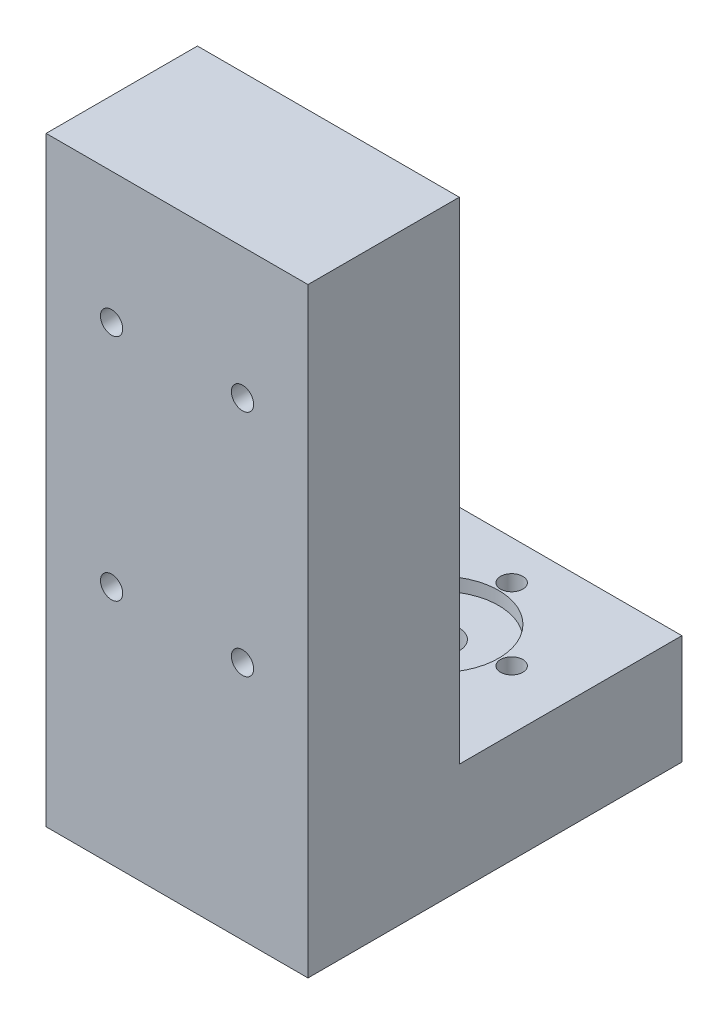
ISO-10303-21;
HEADER;
FILE_DESCRIPTION(('STEP AP214'),'2;1');
FILE_NAME('part.step','',(''),(''),'','','');
FILE_SCHEMA(('AUTOMOTIVE_DESIGN { 1 0 10303 214 1 1 1 1 }'));
ENDSEC;
DATA;
#1=APPLICATION_CONTEXT('core data for automotive mechanical design processes');
#2=APPLICATION_PROTOCOL_DEFINITION('international standard','automotive_design',2000,#1);
#3=PRODUCT_CONTEXT('',#1,'mechanical');
#4=PRODUCT('Part','Part','',(#3));
#5=PRODUCT_RELATED_PRODUCT_CATEGORY('part','',(#4));
#6=PRODUCT_DEFINITION_FORMATION('','',#4);
#7=PRODUCT_DEFINITION_CONTEXT('part definition',#1,'design');
#8=PRODUCT_DEFINITION('design','',#6,#7);
#9=PRODUCT_DEFINITION_SHAPE('','',#8);
#10=(LENGTH_UNIT() NAMED_UNIT(*) SI_UNIT(.MILLI.,.METRE.));
#11=(NAMED_UNIT(*) PLANE_ANGLE_UNIT() SI_UNIT($,.RADIAN.));
#12=(NAMED_UNIT(*) SI_UNIT($,.STERADIAN.) SOLID_ANGLE_UNIT());
#13=UNCERTAINTY_MEASURE_WITH_UNIT(LENGTH_MEASURE(1.E-05),#10,'distance_accuracy_value','');
#14=(GEOMETRIC_REPRESENTATION_CONTEXT(3) GLOBAL_UNCERTAINTY_ASSIGNED_CONTEXT((#13)) GLOBAL_UNIT_ASSIGNED_CONTEXT((#10,
#11,#12)) REPRESENTATION_CONTEXT('',''));
#15=CARTESIAN_POINT('',(0.,0.,0.));
#16=DIRECTION('',(0.,0.,1.));
#17=DIRECTION('',(1.,0.,0.));
#18=AXIS2_PLACEMENT_3D('',#15,#16,#17);
#19=CARTESIAN_POINT('',(10.,20.,27.9206936952474));
#20=DIRECTION('',(0.,0.,-1.));
#21=DIRECTION('',(0.,1.,0.));
#22=AXIS2_PLACEMENT_3D('',#19,#20,#21);
#23=CYLINDRICAL_SURFACE('',#22,1.7);
#24=CARTESIAN_POINT('',(10.,20.,23.1123675831789));
#25=DIRECTION('',(0.,0.,-1.));
#26=DIRECTION('',(-1.,0.,0.));
#27=AXIS2_PLACEMENT_3D('',#24,#25,#26);
#28=CIRCLE('',#27,1.7);
#29=CARTESIAN_POINT('',(10.,21.7,23.1123675831789));
#30=VERTEX_POINT('',#29);
#31=EDGE_CURVE('E53',#30,#30,#28,.F.);
#32=CARTESIAN_POINT('',(10.,20.,0.));
#33=DIRECTION('',(0.,0.,-1.));
#34=DIRECTION('',(0.,1.,0.));
#35=AXIS2_PLACEMENT_3D('',#32,#33,#34);
#36=CIRCLE('',#35,1.7);
#37=CARTESIAN_POINT('',(10.,21.7,0.));
#38=VERTEX_POINT('',#37);
#39=EDGE_CURVE('E11',#38,#38,#36,.T.);
#40=CARTESIAN_POINT('',(10.,21.7,23.1123675831789));
#41=CARTESIAN_POINT('',(10.,21.7,22.8716137541875));
#42=CARTESIAN_POINT('',(10.,21.7,22.630859925196));
#43=CARTESIAN_POINT('',(10.,21.7,22.1493522672131));
#44=CARTESIAN_POINT('',(10.,21.7,21.9085984382217));
#45=CARTESIAN_POINT('',(10.,21.7,21.4270907802388));
#46=CARTESIAN_POINT('',(10.,21.7,21.1863369512473));
#47=CARTESIAN_POINT('',(10.,21.7,20.7048292932644));
#48=CARTESIAN_POINT('',(10.,21.7,20.464075464273));
#49=CARTESIAN_POINT('',(10.,21.7,19.9825678062901));
#50=CARTESIAN_POINT('',(10.,21.7,19.7418139772987));
#51=CARTESIAN_POINT('',(10.,21.7,19.2603063193158));
#52=CARTESIAN_POINT('',(10.,21.7,19.0195524903243));
#53=CARTESIAN_POINT('',(10.,21.7,18.5380448323414));
#54=CARTESIAN_POINT('',(10.,21.7,18.29729100335));
#55=CARTESIAN_POINT('',(10.,21.7,17.8157833453671));
#56=CARTESIAN_POINT('',(10.,21.7,17.5750295163756));
#57=CARTESIAN_POINT('',(10.,21.7,17.0935218583927));
#58=CARTESIAN_POINT('',(10.,21.7,16.8527680294013));
#59=CARTESIAN_POINT('',(10.,21.7,16.3712603714184));
#60=CARTESIAN_POINT('',(10.,21.7,16.130506542427));
#61=CARTESIAN_POINT('',(10.,21.7,15.6489988844441));
#62=CARTESIAN_POINT('',(10.,21.7,15.4082450554526));
#63=CARTESIAN_POINT('',(10.,21.7,14.9267373974697));
#64=CARTESIAN_POINT('',(10.,21.7,14.6859835684783));
#65=CARTESIAN_POINT('',(10.,21.7,14.2044759104954));
#66=CARTESIAN_POINT('',(10.,21.7,13.9637220815039));
#67=CARTESIAN_POINT('',(10.,21.7,13.482214423521));
#68=CARTESIAN_POINT('',(10.,21.7,13.2414605945296));
#69=CARTESIAN_POINT('',(10.,21.7,12.7599529365467));
#70=CARTESIAN_POINT('',(10.,21.7,12.5191991075553));
#71=CARTESIAN_POINT('',(10.,21.7,12.0376914495724));
#72=CARTESIAN_POINT('',(10.,21.7,11.7969376205809));
#73=CARTESIAN_POINT('',(10.,21.7,11.315429962598));
#74=CARTESIAN_POINT('',(10.,21.7,11.0746761336066));
#75=CARTESIAN_POINT('',(10.,21.7,10.5931684756237));
#76=CARTESIAN_POINT('',(10.,21.7,10.3524146466322));
#77=CARTESIAN_POINT('',(10.,21.7,9.87090698864933));
#78=CARTESIAN_POINT('',(10.,21.7,9.63015315965789));
#79=CARTESIAN_POINT('',(10.,21.7,9.14864550167499));
#80=CARTESIAN_POINT('',(10.,21.7,8.90789167268355));
#81=CARTESIAN_POINT('',(10.,21.7,8.42638401470065));
#82=CARTESIAN_POINT('',(10.,21.7,8.18563018570921));
#83=CARTESIAN_POINT('',(10.,21.7,7.70412252772631));
#84=CARTESIAN_POINT('',(10.,21.7,7.46336869873486));
#85=CARTESIAN_POINT('',(10.,21.7,6.98186104075197));
#86=CARTESIAN_POINT('',(10.,21.7,6.74110721176052));
#87=CARTESIAN_POINT('',(10.,21.7,6.25959955377763));
#88=CARTESIAN_POINT('',(10.,21.7,6.01884572478618));
#89=CARTESIAN_POINT('',(10.,21.7,5.53733806680329));
#90=CARTESIAN_POINT('',(10.,21.7,5.29658423781184));
#91=CARTESIAN_POINT('',(10.,21.7,4.81507657982895));
#92=CARTESIAN_POINT('',(10.,21.7,4.5743227508375));
#93=CARTESIAN_POINT('',(10.,21.7,4.0928150928546));
#94=CARTESIAN_POINT('',(10.,21.7,3.85206126386316));
#95=CARTESIAN_POINT('',(10.,21.7,3.37055360588026));
#96=CARTESIAN_POINT('',(10.,21.7,3.12979977688882));
#97=CARTESIAN_POINT('',(10.,21.7,2.64829211890592));
#98=CARTESIAN_POINT('',(10.,21.7,2.40753828991448));
#99=CARTESIAN_POINT('',(10.,21.7,1.92603063193158));
#100=CARTESIAN_POINT('',(10.,21.7,1.68527680294013));
#101=CARTESIAN_POINT('',(10.,21.7,1.20376914495724));
#102=CARTESIAN_POINT('',(10.,21.7,0.963015315965794));
#103=CARTESIAN_POINT('',(10.,21.7,0.4815076579829));
#104=CARTESIAN_POINT('',(10.,21.7,0.240753828991452));
#105=CARTESIAN_POINT('',(10.,21.7,0.));
#106=B_SPLINE_CURVE_WITH_KNOTS('',3,(#40,#41,#42,#43,#44,#45,#46,#47,#48,#49,#50,#51,#52,#53,
#54,#55,#56,#57,#58,#59,#60,#61,#62,#63,#64,#65,#66,#67,#68,#69,#70,#71,#72,#73,#74,#75,#76,#77,
#78,#79,#80,#81,#82,#83,#84,#85,#86,#87,#88,#89,#90,#91,#92,#93,#94,#95,#96,#97,#98,#99,#100,
#101,#102,#103,#104,#105),.UNSPECIFIED.,.F.,.F.,(4,2,2,2,2,2,2,2,2,2,2,2,2,2,2,2,2,2,2,2,2,2,2,
2,2,2,2,2,2,2,2,2,4),(0.,0.722261486974341,1.44452297394868,2.16678446092302,2.88904594789736,
3.61130743487171,4.33356892184605,5.05583040882039,5.77809189579473,6.50035338276907,
7.22261486974341,7.94487635671775,8.66713784369209,9.38939933066644,10.1116608176408,
10.8339223046151,11.5561837915895,12.2784452785638,13.0007067655381,13.7229682525125,
14.4452297394868,15.1674912264612,15.8897527134355,16.6120142004098,17.3342756873842,
18.0565371743585,18.7787986613329,19.5010601483072,20.2233216352816,20.9455831222559,
21.6678446092302,22.3901060962046,23.1123675831789),.UNSPECIFIED.);
#107=EDGE_CURVE('BSEAM44',#30,#38,#106,.T.);
#108=ORIENTED_EDGE('',*,*,#31,.T.);
#109=ORIENTED_EDGE('',*,*,#39,.T.);
#110=ORIENTED_EDGE('',*,*,#107,.T.);
#111=ORIENTED_EDGE('',*,*,#107,.F.);
#112=EDGE_LOOP('',(#108,#110,#109,#111));
#113=FACE_BOUND('',#112,.T.);
#114=ADVANCED_FACE('F44',(#113),#23,.F.);
#115=CARTESIAN_POINT('',(-10.,20.,27.9206936952474));
#116=DIRECTION('',(0.,0.,-1.));
#117=DIRECTION('',(0.,1.,0.));
#118=AXIS2_PLACEMENT_3D('',#115,#116,#117);
#119=CYLINDRICAL_SURFACE('',#118,1.7);
#120=CARTESIAN_POINT('',(-10.,20.,23.1123675831789));
#121=DIRECTION('',(0.,0.,-1.));
#122=DIRECTION('',(-1.,0.,0.));
#123=AXIS2_PLACEMENT_3D('',#120,#121,#122);
#124=CIRCLE('',#123,1.7);
#125=CARTESIAN_POINT('',(-10.,21.7,23.1123675831789));
#126=VERTEX_POINT('',#125);
#127=EDGE_CURVE('E168',#126,#126,#124,.F.);
#128=CARTESIAN_POINT('',(-10.,20.,0.));
#129=DIRECTION('',(0.,0.,-1.));
#130=DIRECTION('',(0.,1.,0.));
#131=AXIS2_PLACEMENT_3D('',#128,#129,#130);
#132=CIRCLE('',#131,1.7);
#133=CARTESIAN_POINT('',(-10.,21.7,0.));
#134=VERTEX_POINT('',#133);
#135=EDGE_CURVE('E174',#134,#134,#132,.T.);
#136=CARTESIAN_POINT('',(-10.,21.7,23.1123675831789));
#137=CARTESIAN_POINT('',(-10.,21.7,22.8716137541875));
#138=CARTESIAN_POINT('',(-10.,21.7,22.630859925196));
#139=CARTESIAN_POINT('',(-10.,21.7,22.1493522672131));
#140=CARTESIAN_POINT('',(-10.,21.7,21.9085984382217));
#141=CARTESIAN_POINT('',(-10.,21.7,21.4270907802388));
#142=CARTESIAN_POINT('',(-10.,21.7,21.1863369512473));
#143=CARTESIAN_POINT('',(-10.,21.7,20.7048292932644));
#144=CARTESIAN_POINT('',(-10.,21.7,20.464075464273));
#145=CARTESIAN_POINT('',(-10.,21.7,19.9825678062901));
#146=CARTESIAN_POINT('',(-10.,21.7,19.7418139772987));
#147=CARTESIAN_POINT('',(-10.,21.7,19.2603063193158));
#148=CARTESIAN_POINT('',(-10.,21.7,19.0195524903243));
#149=CARTESIAN_POINT('',(-10.,21.7,18.5380448323414));
#150=CARTESIAN_POINT('',(-10.,21.7,18.29729100335));
#151=CARTESIAN_POINT('',(-10.,21.7,17.8157833453671));
#152=CARTESIAN_POINT('',(-10.,21.7,17.5750295163756));
#153=CARTESIAN_POINT('',(-10.,21.7,17.0935218583927));
#154=CARTESIAN_POINT('',(-10.,21.7,16.8527680294013));
#155=CARTESIAN_POINT('',(-10.,21.7,16.3712603714184));
#156=CARTESIAN_POINT('',(-10.,21.7,16.130506542427));
#157=CARTESIAN_POINT('',(-10.,21.7,15.6489988844441));
#158=CARTESIAN_POINT('',(-10.,21.7,15.4082450554526));
#159=CARTESIAN_POINT('',(-10.,21.7,14.9267373974697));
#160=CARTESIAN_POINT('',(-10.,21.7,14.6859835684783));
#161=CARTESIAN_POINT('',(-10.,21.7,14.2044759104954));
#162=CARTESIAN_POINT('',(-10.,21.7,13.9637220815039));
#163=CARTESIAN_POINT('',(-10.,21.7,13.482214423521));
#164=CARTESIAN_POINT('',(-10.,21.7,13.2414605945296));
#165=CARTESIAN_POINT('',(-10.,21.7,12.7599529365467));
#166=CARTESIAN_POINT('',(-10.,21.7,12.5191991075553));
#167=CARTESIAN_POINT('',(-10.,21.7,12.0376914495724));
#168=CARTESIAN_POINT('',(-10.,21.7,11.7969376205809));
#169=CARTESIAN_POINT('',(-10.,21.7,11.315429962598));
#170=CARTESIAN_POINT('',(-10.,21.7,11.0746761336066));
#171=CARTESIAN_POINT('',(-10.,21.7,10.5931684756237));
#172=CARTESIAN_POINT('',(-10.,21.7,10.3524146466322));
#173=CARTESIAN_POINT('',(-10.,21.7,9.87090698864933));
#174=CARTESIAN_POINT('',(-10.,21.7,9.63015315965789));
#175=CARTESIAN_POINT('',(-10.,21.7,9.14864550167499));
#176=CARTESIAN_POINT('',(-10.,21.7,8.90789167268355));
#177=CARTESIAN_POINT('',(-10.,21.7,8.42638401470065));
#178=CARTESIAN_POINT('',(-10.,21.7,8.18563018570921));
#179=CARTESIAN_POINT('',(-10.,21.7,7.70412252772631));
#180=CARTESIAN_POINT('',(-10.,21.7,7.46336869873486));
#181=CARTESIAN_POINT('',(-10.,21.7,6.98186104075197));
#182=CARTESIAN_POINT('',(-10.,21.7,6.74110721176052));
#183=CARTESIAN_POINT('',(-10.,21.7,6.25959955377763));
#184=CARTESIAN_POINT('',(-10.,21.7,6.01884572478618));
#185=CARTESIAN_POINT('',(-10.,21.7,5.53733806680329));
#186=CARTESIAN_POINT('',(-10.,21.7,5.29658423781184));
#187=CARTESIAN_POINT('',(-10.,21.7,4.81507657982895));
#188=CARTESIAN_POINT('',(-10.,21.7,4.5743227508375));
#189=CARTESIAN_POINT('',(-10.,21.7,4.0928150928546));
#190=CARTESIAN_POINT('',(-10.,21.7,3.85206126386316));
#191=CARTESIAN_POINT('',(-10.,21.7,3.37055360588026));
#192=CARTESIAN_POINT('',(-10.,21.7,3.12979977688882));
#193=CARTESIAN_POINT('',(-10.,21.7,2.64829211890592));
#194=CARTESIAN_POINT('',(-10.,21.7,2.40753828991448));
#195=CARTESIAN_POINT('',(-10.,21.7,1.92603063193158));
#196=CARTESIAN_POINT('',(-10.,21.7,1.68527680294013));
#197=CARTESIAN_POINT('',(-10.,21.7,1.20376914495724));
#198=CARTESIAN_POINT('',(-10.,21.7,0.963015315965794));
#199=CARTESIAN_POINT('',(-10.,21.7,0.4815076579829));
#200=CARTESIAN_POINT('',(-10.,21.7,0.240753828991452));
#201=CARTESIAN_POINT('',(-10.,21.7,0.));
#202=B_SPLINE_CURVE_WITH_KNOTS('',3,(#136,#137,#138,#139,#140,#141,#142,#143,#144,#145,#146,
#147,#148,#149,#150,#151,#152,#153,#154,#155,#156,#157,#158,#159,#160,#161,#162,#163,#164,#165,
#166,#167,#168,#169,#170,#171,#172,#173,#174,#175,#176,#177,#178,#179,#180,#181,#182,#183,#184,
#185,#186,#187,#188,#189,#190,#191,#192,#193,#194,#195,#196,#197,#198,#199,#200,#201),
.UNSPECIFIED.,.F.,.F.,(4,2,2,2,2,2,2,2,2,2,2,2,2,2,2,2,2,2,2,2,2,2,2,2,2,2,2,2,2,2,2,2,4),(0.,
0.722261486974341,1.44452297394868,2.16678446092302,2.88904594789736,3.61130743487171,
4.33356892184605,5.05583040882039,5.77809189579473,6.50035338276907,7.22261486974341,
7.94487635671775,8.66713784369209,9.38939933066644,10.1116608176408,10.8339223046151,
11.5561837915895,12.2784452785638,13.0007067655381,13.7229682525125,14.4452297394868,
15.1674912264612,15.8897527134355,16.6120142004098,17.3342756873842,18.0565371743585,
18.7787986613329,19.5010601483072,20.2233216352816,20.9455831222559,21.6678446092302,
22.3901060962046,23.1123675831789),.UNSPECIFIED.);
#203=EDGE_CURVE('BSEAM204',#126,#134,#202,.T.);
#204=ORIENTED_EDGE('',*,*,#127,.T.);
#205=ORIENTED_EDGE('',*,*,#135,.T.);
#206=ORIENTED_EDGE('',*,*,#203,.T.);
#207=ORIENTED_EDGE('',*,*,#203,.F.);
#208=EDGE_LOOP('',(#204,#206,#205,#207));
#209=FACE_BOUND('',#208,.T.);
#210=ADVANCED_FACE('F204',(#209),#119,.F.);
#211=CARTESIAN_POINT('',(0.,-25.2143187875923,-17.));
#212=DIRECTION('',(0.,1.,0.));
#213=DIRECTION('',(0.,0.,1.));
#214=AXIS2_PLACEMENT_3D('',#211,#212,#213);
#215=CYLINDRICAL_SURFACE('',#214,3.);
#216=CARTESIAN_POINT('',(0.,-16.7290374133537,-17.));
#217=DIRECTION('',(0.,1.,0.));
#218=DIRECTION('',(0.,0.,1.));
#219=AXIS2_PLACEMENT_3D('',#216,#217,#218);
#220=CIRCLE('',#219,3.);
#221=CARTESIAN_POINT('',(0.,-16.7290374133537,-14.));
#222=VERTEX_POINT('',#221);
#223=EDGE_CURVE('E138',#222,#222,#220,.F.);
#224=ORIENTED_EDGE('',*,*,#223,.T.);
#225=EDGE_LOOP('',(#224));
#226=FACE_BOUND('',#225,.T.);
#227=CARTESIAN_POINT('',(0.,-2.,-17.));
#228=DIRECTION('',(0.,1.,0.));
#229=DIRECTION('',(0.,0.,1.));
#230=AXIS2_PLACEMENT_3D('',#227,#228,#229);
#231=CIRCLE('',#230,3.);
#232=CARTESIAN_POINT('',(0.,-2.,-14.));
#233=VERTEX_POINT('',#232);
#234=EDGE_CURVE('E170',#233,#233,#231,.F.);
#235=ORIENTED_EDGE('',*,*,#234,.F.);
#236=EDGE_LOOP('',(#235));
#237=FACE_BOUND('',#236,.T.);
#238=ADVANCED_FACE('F210',(#226,#237),#215,.F.);
#239=CARTESIAN_POINT('',(20.,75.,0.));
#240=DIRECTION('',(0.,0.,1.));
#241=DIRECTION('',(0.,-1.,0.));
#242=AXIS2_PLACEMENT_3D('',#239,#240,#241);
#243=PLANE('',#242);
#244=CARTESIAN_POINT('',(10.,55.,0.));
#245=DIRECTION('',(0.,0.,-1.));
#246=DIRECTION('',(0.,1.,0.));
#247=AXIS2_PLACEMENT_3D('',#244,#245,#246);
#248=CIRCLE('',#247,1.7);
#249=CARTESIAN_POINT('',(10.,56.7,0.));
#250=VERTEX_POINT('',#249);
#251=EDGE_CURVE('E224',#250,#250,#248,.T.);
#252=ORIENTED_EDGE('',*,*,#251,.F.);
#253=EDGE_LOOP('',(#252));
#254=FACE_BOUND('',#253,.T.);
#255=CARTESIAN_POINT('',(-10.,55.,0.));
#256=DIRECTION('',(0.,0.,-1.));
#257=DIRECTION('',(0.,1.,0.));
#258=AXIS2_PLACEMENT_3D('',#255,#256,#257);
#259=CIRCLE('',#258,1.7);
#260=CARTESIAN_POINT('',(-10.,56.7,0.));
#261=VERTEX_POINT('',#260);
#262=EDGE_CURVE('E228',#261,#261,#259,.T.);
#263=ORIENTED_EDGE('',*,*,#262,.F.);
#264=EDGE_LOOP('',(#263));
#265=FACE_BOUND('',#264,.T.);
#266=DIRECTION('',(0.,1.,0.));
#267=VECTOR('',#266,1.);
#268=CARTESIAN_POINT('',(-20.,75.,0.));
#269=LINE('',#268,#267);
#270=CARTESIAN_POINT('',(-20.,0.,0.));
#271=VERTEX_POINT('',#270);
#272=CARTESIAN_POINT('',(-20.,75.,0.));
#273=VERTEX_POINT('',#272);
#274=EDGE_CURVE('E134',#271,#273,#269,.T.);
#275=ORIENTED_EDGE('',*,*,#274,.T.);
#276=DIRECTION('',(-1.,0.,0.));
#277=VECTOR('',#276,1.);
#278=CARTESIAN_POINT('',(20.,75.,0.));
#279=LINE('',#278,#277);
#280=CARTESIAN_POINT('',(20.,75.,0.));
#281=VERTEX_POINT('',#280);
#282=EDGE_CURVE('E161',#281,#273,#279,.T.);
#283=ORIENTED_EDGE('',*,*,#282,.F.);
#284=DIRECTION('',(0.,1.,0.));
#285=VECTOR('',#284,1.);
#286=CARTESIAN_POINT('',(20.,75.,0.));
#287=LINE('',#286,#285);
#288=CARTESIAN_POINT('',(20.,0.,0.));
#289=VERTEX_POINT('',#288);
#290=EDGE_CURVE('E155',#289,#281,#287,.T.);
#291=ORIENTED_EDGE('',*,*,#290,.F.);
#292=DIRECTION('',(-1.,0.,0.));
#293=VECTOR('',#292,1.);
#294=CARTESIAN_POINT('',(20.,0.,0.));
#295=LINE('',#294,#293);
#296=EDGE_CURVE('E131',#289,#271,#295,.T.);
#297=ORIENTED_EDGE('',*,*,#296,.T.);
#298=EDGE_LOOP('',(#275,#283,#291,#297));
#299=FACE_BOUND('',#298,.T.);
#300=ORIENTED_EDGE('',*,*,#135,.F.);
#301=EDGE_LOOP('',(#300));
#302=FACE_BOUND('',#301,.T.);
#303=ORIENTED_EDGE('',*,*,#39,.F.);
#304=EDGE_LOOP('',(#303));
#305=FACE_BOUND('',#304,.T.);
#306=ADVANCED_FACE('F200',(#254,#265,#299,#302,#305),#243,.F.);
#307=CARTESIAN_POINT('',(20.,75.,23.1123675831789));
#308=DIRECTION('',(0.,-1.,0.));
#309=DIRECTION('',(0.,0.,-1.));
#310=AXIS2_PLACEMENT_3D('',#307,#308,#309);
#311=PLANE('',#310);
#312=DIRECTION('',(0.,0.,1.));
#313=VECTOR('',#312,1.);
#314=CARTESIAN_POINT('',(-20.,75.,23.1123675831789));
#315=LINE('',#314,#313);
#316=CARTESIAN_POINT('',(-20.,75.,23.1123675831789));
#317=VERTEX_POINT('',#316);
#318=EDGE_CURVE('E136',#273,#317,#315,.T.);
#319=ORIENTED_EDGE('',*,*,#318,.T.);
#320=DIRECTION('',(-1.,0.,0.));
#321=VECTOR('',#320,1.);
#322=CARTESIAN_POINT('',(20.,75.,23.1123675831789));
#323=LINE('',#322,#321);
#324=CARTESIAN_POINT('',(20.,75.,23.1123675831789));
#325=VERTEX_POINT('',#324);
#326=EDGE_CURVE('E156',#325,#317,#323,.T.);
#327=ORIENTED_EDGE('',*,*,#326,.F.);
#328=DIRECTION('',(0.,0.,1.));
#329=VECTOR('',#328,1.);
#330=CARTESIAN_POINT('',(20.,75.,23.1123675831789));
#331=LINE('',#330,#329);
#332=EDGE_CURVE('E99',#281,#325,#331,.T.);
#333=ORIENTED_EDGE('',*,*,#332,.F.);
#334=ORIENTED_EDGE('',*,*,#282,.T.);
#335=EDGE_LOOP('',(#319,#327,#333,#334));
#336=FACE_BOUND('',#335,.T.);
#337=ADVANCED_FACE('F187',(#336),#311,.F.);
#338=CARTESIAN_POINT('',(20.,-16.7290374133537,23.1123675831789));
#339=DIRECTION('',(0.,0.,-1.));
#340=DIRECTION('',(-1.,0.,0.));
#341=AXIS2_PLACEMENT_3D('',#338,#339,#340);
#342=PLANE('',#341);
#343=CARTESIAN_POINT('',(10.,55.,23.1123675831789));
#344=DIRECTION('',(0.,0.,-1.));
#345=DIRECTION('',(-1.,0.,0.));
#346=AXIS2_PLACEMENT_3D('',#343,#344,#345);
#347=CIRCLE('',#346,1.7);
#348=CARTESIAN_POINT('',(10.,56.7,23.1123675831789));
#349=VERTEX_POINT('',#348);
#350=EDGE_CURVE('E294',#349,#349,#347,.F.);
#351=ORIENTED_EDGE('',*,*,#350,.F.);
#352=EDGE_LOOP('',(#351));
#353=FACE_BOUND('',#352,.T.);
#354=CARTESIAN_POINT('',(-10.,55.,23.1123675831789));
#355=DIRECTION('',(0.,0.,-1.));
#356=DIRECTION('',(-1.,0.,0.));
#357=AXIS2_PLACEMENT_3D('',#354,#355,#356);
#358=CIRCLE('',#357,1.7);
#359=CARTESIAN_POINT('',(-10.,56.7,23.1123675831789));
#360=VERTEX_POINT('',#359);
#361=EDGE_CURVE('E271',#360,#360,#358,.F.);
#362=ORIENTED_EDGE('',*,*,#361,.F.);
#363=EDGE_LOOP('',(#362));
#364=FACE_BOUND('',#363,.T.);
#365=DIRECTION('',(0.,-1.,0.));
#366=VECTOR('',#365,1.);
#367=CARTESIAN_POINT('',(-20.,-16.7290374133537,23.1123675831789));
#368=LINE('',#367,#366);
#369=CARTESIAN_POINT('',(-20.,-16.7290374133537,23.1123675831789));
#370=VERTEX_POINT('',#369);
#371=EDGE_CURVE('E141',#317,#370,#368,.T.);
#372=ORIENTED_EDGE('',*,*,#371,.T.);
#373=DIRECTION('',(-1.,0.,0.));
#374=VECTOR('',#373,1.);
#375=CARTESIAN_POINT('',(20.,-16.7290374133537,23.1123675831789));
#376=LINE('',#375,#374);
#377=CARTESIAN_POINT('',(20.,-16.7290374133537,23.1123675831789));
#378=VERTEX_POINT('',#377);
#379=EDGE_CURVE('E121',#378,#370,#376,.T.);
#380=ORIENTED_EDGE('',*,*,#379,.F.);
#381=DIRECTION('',(0.,-1.,0.));
#382=VECTOR('',#381,1.);
#383=CARTESIAN_POINT('',(20.,-16.7290374133537,23.1123675831789));
#384=LINE('',#383,#382);
#385=EDGE_CURVE('E113',#325,#378,#384,.T.);
#386=ORIENTED_EDGE('',*,*,#385,.F.);
#387=ORIENTED_EDGE('',*,*,#326,.T.);
#388=EDGE_LOOP('',(#372,#380,#386,#387));
#389=FACE_BOUND('',#388,.T.);
#390=ORIENTED_EDGE('',*,*,#127,.F.);
#391=EDGE_LOOP('',(#390));
#392=FACE_BOUND('',#391,.T.);
#393=ORIENTED_EDGE('',*,*,#31,.F.);
#394=EDGE_LOOP('',(#393));
#395=FACE_BOUND('',#394,.T.);
#396=ADVANCED_FACE('F183',(#353,#364,#389,#392,#395),#342,.F.);
#397=CARTESIAN_POINT('',(20.,-16.7290374133537,-34.));
#398=DIRECTION('',(0.,1.,0.));
#399=DIRECTION('',(0.,0.,1.));
#400=AXIS2_PLACEMENT_3D('',#397,#398,#399);
#401=PLANE('',#400);
#402=CARTESIAN_POINT('',(-11.,-16.7290374133537,-17.));
#403=DIRECTION('',(0.,1.,0.));
#404=DIRECTION('',(0.,0.,1.));
#405=AXIS2_PLACEMENT_3D('',#402,#403,#404);
#406=CIRCLE('',#405,1.7);
#407=CARTESIAN_POINT('',(-11.,-16.7290374133537,-15.3));
#408=VERTEX_POINT('',#407);
#409=EDGE_CURVE('E262',#408,#408,#406,.F.);
#410=ORIENTED_EDGE('',*,*,#409,.F.);
#411=EDGE_LOOP('',(#410));
#412=FACE_BOUND('',#411,.T.);
#413=CARTESIAN_POINT('',(0.,-16.7290374133537,-6.));
#414=DIRECTION('',(0.,1.,0.));
#415=DIRECTION('',(0.,0.,1.));
#416=AXIS2_PLACEMENT_3D('',#413,#414,#415);
#417=CIRCLE('',#416,1.7);
#418=CARTESIAN_POINT('',(0.,-16.7290374133537,-4.3));
#419=VERTEX_POINT('',#418);
#420=EDGE_CURVE('E274',#419,#419,#417,.F.);
#421=ORIENTED_EDGE('',*,*,#420,.F.);
#422=EDGE_LOOP('',(#421));
#423=FACE_BOUND('',#422,.T.);
#424=CARTESIAN_POINT('',(11.,-16.7290374133537,-17.0000000000001));
#425=DIRECTION('',(0.,1.,0.));
#426=DIRECTION('',(0.,0.,1.));
#427=AXIS2_PLACEMENT_3D('',#424,#425,#426);
#428=CIRCLE('',#427,1.7);
#429=CARTESIAN_POINT('',(11.,-16.7290374133537,-15.3000000000001));
#430=VERTEX_POINT('',#429);
#431=EDGE_CURVE('E263',#430,#430,#428,.F.);
#432=ORIENTED_EDGE('',*,*,#431,.F.);
#433=EDGE_LOOP('',(#432));
#434=FACE_BOUND('',#433,.T.);
#435=CARTESIAN_POINT('',(0.,-16.7290374133537,-28.));
#436=DIRECTION('',(0.,1.,0.));
#437=DIRECTION('',(0.,0.,1.));
#438=AXIS2_PLACEMENT_3D('',#435,#436,#437);
#439=CIRCLE('',#438,1.7);
#440=CARTESIAN_POINT('',(0.,-16.7290374133537,-26.3));
#441=VERTEX_POINT('',#440);
#442=EDGE_CURVE('E255',#441,#441,#439,.F.);
#443=ORIENTED_EDGE('',*,*,#442,.F.);
#444=EDGE_LOOP('',(#443));
#445=FACE_BOUND('',#444,.T.);
#446=ORIENTED_EDGE('',*,*,#223,.F.);
#447=EDGE_LOOP('',(#446));
#448=FACE_BOUND('',#447,.T.);
#449=DIRECTION('',(0.,0.,-1.));
#450=VECTOR('',#449,1.);
#451=CARTESIAN_POINT('',(-20.,-16.7290374133537,-34.));
#452=LINE('',#451,#450);
#453=CARTESIAN_POINT('',(-20.,-16.7290374133537,-34.));
#454=VERTEX_POINT('',#453);
#455=EDGE_CURVE('E125',#370,#454,#452,.T.);
#456=ORIENTED_EDGE('',*,*,#455,.T.);
#457=DIRECTION('',(-1.,0.,0.));
#458=VECTOR('',#457,1.);
#459=CARTESIAN_POINT('',(20.,-16.7290374133537,-34.));
#460=LINE('',#459,#458);
#461=CARTESIAN_POINT('',(20.,-16.7290374133537,-34.));
#462=VERTEX_POINT('',#461);
#463=EDGE_CURVE('E118',#462,#454,#460,.T.);
#464=ORIENTED_EDGE('',*,*,#463,.F.);
#465=DIRECTION('',(0.,0.,-1.));
#466=VECTOR('',#465,1.);
#467=CARTESIAN_POINT('',(20.,-16.7290374133537,-34.));
#468=LINE('',#467,#466);
#469=EDGE_CURVE('E110',#378,#462,#468,.T.);
#470=ORIENTED_EDGE('',*,*,#469,.F.);
#471=ORIENTED_EDGE('',*,*,#379,.T.);
#472=EDGE_LOOP('',(#456,#464,#470,#471));
#473=FACE_BOUND('',#472,.T.);
#474=ADVANCED_FACE('F119',(#412,#423,#434,#445,#448,#473),#401,.F.);
#475=CARTESIAN_POINT('',(20.,0.,-34.));
#476=DIRECTION('',(0.,0.,1.));
#477=DIRECTION('',(1.,0.,0.));
#478=AXIS2_PLACEMENT_3D('',#475,#476,#477);
#479=PLANE('',#478);
#480=DIRECTION('',(0.,1.,0.));
#481=VECTOR('',#480,1.);
#482=CARTESIAN_POINT('',(-20.,0.,-34.));
#483=LINE('',#482,#481);
#484=CARTESIAN_POINT('',(-20.,0.,-34.));
#485=VERTEX_POINT('',#484);
#486=EDGE_CURVE('E83',#454,#485,#483,.T.);
#487=ORIENTED_EDGE('',*,*,#486,.T.);
#488=DIRECTION('',(-1.,0.,0.));
#489=VECTOR('',#488,1.);
#490=CARTESIAN_POINT('',(20.,0.,-34.));
#491=LINE('',#490,#489);
#492=CARTESIAN_POINT('',(20.,0.,-34.));
#493=VERTEX_POINT('',#492);
#494=EDGE_CURVE('E123',#493,#485,#491,.T.);
#495=ORIENTED_EDGE('',*,*,#494,.F.);
#496=DIRECTION('',(0.,1.,0.));
#497=VECTOR('',#496,1.);
#498=CARTESIAN_POINT('',(20.,0.,-34.));
#499=LINE('',#498,#497);
#500=EDGE_CURVE('E111',#462,#493,#499,.T.);
#501=ORIENTED_EDGE('',*,*,#500,.F.);
#502=ORIENTED_EDGE('',*,*,#463,.T.);
#503=EDGE_LOOP('',(#487,#495,#501,#502));
#504=FACE_BOUND('',#503,.T.);
#505=ADVANCED_FACE('F130',(#504),#479,.F.);
#506=CARTESIAN_POINT('',(20.,0.,0.));
#507=DIRECTION('',(0.,-1.,0.));
#508=DIRECTION('',(0.,0.,-1.));
#509=AXIS2_PLACEMENT_3D('',#506,#507,#508);
#510=PLANE('',#509);
#511=CARTESIAN_POINT('',(-11.,0.,-17.));
#512=DIRECTION('',(0.,1.,0.));
#513=DIRECTION('',(1.,0.,0.));
#514=AXIS2_PLACEMENT_3D('',#511,#512,#513);
#515=CIRCLE('',#514,1.7);
#516=CARTESIAN_POINT('',(-9.3,0.,-17.));
#517=VERTEX_POINT('',#516);
#518=EDGE_CURVE('E279',#517,#517,#515,.T.);
#519=ORIENTED_EDGE('',*,*,#518,.F.);
#520=EDGE_LOOP('',(#519));
#521=FACE_BOUND('',#520,.T.);
#522=CARTESIAN_POINT('',(0.,0.,-6.));
#523=DIRECTION('',(0.,1.,0.));
#524=DIRECTION('',(0.,0.,-1.));
#525=AXIS2_PLACEMENT_3D('',#522,#523,#524);
#526=CIRCLE('',#525,1.7);
#527=CARTESIAN_POINT('',(0.,0.,-7.7));
#528=VERTEX_POINT('',#527);
#529=EDGE_CURVE('E270',#528,#528,#526,.T.);
#530=ORIENTED_EDGE('',*,*,#529,.F.);
#531=EDGE_LOOP('',(#530));
#532=FACE_BOUND('',#531,.T.);
#533=CARTESIAN_POINT('',(11.,0.,-17.0000000000001));
#534=DIRECTION('',(0.,1.,0.));
#535=DIRECTION('',(-1.,0.,0.));
#536=AXIS2_PLACEMENT_3D('',#533,#534,#535);
#537=CIRCLE('',#536,1.7);
#538=CARTESIAN_POINT('',(9.3,0.,-17.0000000000001));
#539=VERTEX_POINT('',#538);
#540=EDGE_CURVE('E266',#539,#539,#537,.T.);
#541=ORIENTED_EDGE('',*,*,#540,.F.);
#542=EDGE_LOOP('',(#541));
#543=FACE_BOUND('',#542,.T.);
#544=CARTESIAN_POINT('',(0.,0.,-28.));
#545=DIRECTION('',(0.,1.,0.));
#546=DIRECTION('',(0.,0.,1.));
#547=AXIS2_PLACEMENT_3D('',#544,#545,#546);
#548=CIRCLE('',#547,1.7);
#549=CARTESIAN_POINT('',(0.,0.,-26.3));
#550=VERTEX_POINT('',#549);
#551=EDGE_CURVE('E256',#550,#550,#548,.T.);
#552=ORIENTED_EDGE('',*,*,#551,.F.);
#553=EDGE_LOOP('',(#552));
#554=FACE_BOUND('',#553,.T.);
#555=CARTESIAN_POINT('',(0.,0.,-17.));
#556=DIRECTION('',(0.,1.,0.));
#557=DIRECTION('',(0.,0.,1.));
#558=AXIS2_PLACEMENT_3D('',#555,#556,#557);
#559=CIRCLE('',#558,9.);
#560=CARTESIAN_POINT('',(0.,0.,-8.));
#561=VERTEX_POINT('',#560);
#562=EDGE_CURVE('E247',#561,#561,#559,.T.);
#563=ORIENTED_EDGE('',*,*,#562,.F.);
#564=EDGE_LOOP('',(#563));
#565=FACE_BOUND('',#564,.T.);
#566=DIRECTION('',(0.,0.,1.));
#567=VECTOR('',#566,1.);
#568=CARTESIAN_POINT('',(-20.,0.,0.));
#569=LINE('',#568,#567);
#570=EDGE_CURVE('E92',#485,#271,#569,.T.);
#571=ORIENTED_EDGE('',*,*,#570,.T.);
#572=ORIENTED_EDGE('',*,*,#296,.F.);
#573=DIRECTION('',(0.,0.,1.));
#574=VECTOR('',#573,1.);
#575=CARTESIAN_POINT('',(20.,0.,0.));
#576=LINE('',#575,#574);
#577=EDGE_CURVE('E65',#493,#289,#576,.T.);
#578=ORIENTED_EDGE('',*,*,#577,.F.);
#579=ORIENTED_EDGE('',*,*,#494,.T.);
#580=EDGE_LOOP('',(#571,#572,#578,#579));
#581=FACE_BOUND('',#580,.T.);
#582=ADVANCED_FACE('F331',(#521,#532,#543,#554,#565,#581),#510,.F.);
#583=CARTESIAN_POINT('',(20.,0.,0.));
#584=DIRECTION('',(1.,0.,0.));
#585=DIRECTION('',(0.,0.,-1.));
#586=AXIS2_PLACEMENT_3D('',#583,#584,#585);
#587=PLANE('',#586);
#588=ORIENTED_EDGE('',*,*,#290,.T.);
#589=ORIENTED_EDGE('',*,*,#332,.T.);
#590=ORIENTED_EDGE('',*,*,#385,.T.);
#591=ORIENTED_EDGE('',*,*,#469,.T.);
#592=ORIENTED_EDGE('',*,*,#500,.T.);
#593=ORIENTED_EDGE('',*,*,#577,.T.);
#594=EDGE_LOOP('',(#588,#589,#590,#591,#592,#593));
#595=FACE_BOUND('',#594,.T.);
#596=ADVANCED_FACE('F107',(#595),#587,.T.);
#597=CARTESIAN_POINT('',(-20.,0.,0.));
#598=DIRECTION('',(1.,0.,0.));
#599=DIRECTION('',(0.,0.,-1.));
#600=AXIS2_PLACEMENT_3D('',#597,#598,#599);
#601=PLANE('',#600);
#602=ORIENTED_EDGE('',*,*,#274,.F.);
#603=ORIENTED_EDGE('',*,*,#570,.F.);
#604=ORIENTED_EDGE('',*,*,#486,.F.);
#605=ORIENTED_EDGE('',*,*,#455,.F.);
#606=ORIENTED_EDGE('',*,*,#371,.F.);
#607=ORIENTED_EDGE('',*,*,#318,.F.);
#608=EDGE_LOOP('',(#602,#603,#604,#605,#606,#607));
#609=FACE_BOUND('',#608,.T.);
#610=ADVANCED_FACE('F232',(#609),#601,.F.);
#611=CARTESIAN_POINT('',(0.,-2.,-17.));
#612=DIRECTION('',(0.,1.,0.));
#613=DIRECTION('',(0.,0.,1.));
#614=AXIS2_PLACEMENT_3D('',#611,#612,#613);
#615=PLANE('',#614);
#616=CARTESIAN_POINT('',(0.,-2.,-17.));
#617=DIRECTION('',(0.,1.,0.));
#618=DIRECTION('',(0.,0.,1.));
#619=AXIS2_PLACEMENT_3D('',#616,#617,#618);
#620=CIRCLE('',#619,9.);
#621=CARTESIAN_POINT('',(0.,-2.,-8.));
#622=VERTEX_POINT('',#621);
#623=EDGE_CURVE('E171',#622,#622,#620,.T.);
#624=ORIENTED_EDGE('',*,*,#623,.T.);
#625=EDGE_LOOP('',(#624));
#626=FACE_BOUND('',#625,.T.);
#627=ORIENTED_EDGE('',*,*,#234,.T.);
#628=EDGE_LOOP('',(#627));
#629=FACE_BOUND('',#628,.T.);
#630=ADVANCED_FACE('F323',(#626,#629),#615,.T.);
#631=CARTESIAN_POINT('',(0.,-2.,-17.));
#632=DIRECTION('',(0.,1.,0.));
#633=DIRECTION('',(0.,0.,1.));
#634=AXIS2_PLACEMENT_3D('',#631,#632,#633);
#635=CYLINDRICAL_SURFACE('',#634,9.);
#636=ORIENTED_EDGE('',*,*,#623,.F.);
#637=EDGE_LOOP('',(#636));
#638=FACE_BOUND('',#637,.T.);
#639=ORIENTED_EDGE('',*,*,#562,.T.);
#640=EDGE_LOOP('',(#639));
#641=FACE_BOUND('',#640,.T.);
#642=ADVANCED_FACE('F324',(#638,#641),#635,.F.);
#643=CARTESIAN_POINT('',(0.,-21.5373635254222,-28.));
#644=DIRECTION('',(0.,1.,0.));
#645=DIRECTION('',(0.,0.,1.));
#646=AXIS2_PLACEMENT_3D('',#643,#644,#645);
#647=CYLINDRICAL_SURFACE('',#646,1.7);
#648=ORIENTED_EDGE('',*,*,#442,.T.);
#649=EDGE_LOOP('',(#648));
#650=FACE_BOUND('',#649,.T.);
#651=ORIENTED_EDGE('',*,*,#551,.T.);
#652=EDGE_LOOP('',(#651));
#653=FACE_BOUND('',#652,.T.);
#654=ADVANCED_FACE('F316',(#650,#653),#647,.F.);
#655=CARTESIAN_POINT('',(11.,-21.5373635254222,-17.0000000000001));
#656=DIRECTION('',(0.,1.,0.));
#657=DIRECTION('',(0.,0.,1.));
#658=AXIS2_PLACEMENT_3D('',#655,#656,#657);
#659=CYLINDRICAL_SURFACE('',#658,1.7);
#660=ORIENTED_EDGE('',*,*,#431,.T.);
#661=EDGE_LOOP('',(#660));
#662=FACE_BOUND('',#661,.T.);
#663=ORIENTED_EDGE('',*,*,#540,.T.);
#664=EDGE_LOOP('',(#663));
#665=FACE_BOUND('',#664,.T.);
#666=ADVANCED_FACE('F314',(#662,#665),#659,.F.);
#667=CARTESIAN_POINT('',(0.,-21.5373635254222,-6.));
#668=DIRECTION('',(0.,1.,0.));
#669=DIRECTION('',(0.,0.,1.));
#670=AXIS2_PLACEMENT_3D('',#667,#668,#669);
#671=CYLINDRICAL_SURFACE('',#670,1.7);
#672=ORIENTED_EDGE('',*,*,#420,.T.);
#673=EDGE_LOOP('',(#672));
#674=FACE_BOUND('',#673,.T.);
#675=ORIENTED_EDGE('',*,*,#529,.T.);
#676=EDGE_LOOP('',(#675));
#677=FACE_BOUND('',#676,.T.);
#678=ADVANCED_FACE('F311',(#674,#677),#671,.F.);
#679=CARTESIAN_POINT('',(-11.,-21.5373635254222,-17.));
#680=DIRECTION('',(0.,1.,0.));
#681=DIRECTION('',(0.,0.,1.));
#682=AXIS2_PLACEMENT_3D('',#679,#680,#681);
#683=CYLINDRICAL_SURFACE('',#682,1.7);
#684=ORIENTED_EDGE('',*,*,#409,.T.);
#685=EDGE_LOOP('',(#684));
#686=FACE_BOUND('',#685,.T.);
#687=ORIENTED_EDGE('',*,*,#518,.T.);
#688=EDGE_LOOP('',(#687));
#689=FACE_BOUND('',#688,.T.);
#690=ADVANCED_FACE('F304',(#686,#689),#683,.F.);
#691=CARTESIAN_POINT('',(-10.,55.,27.9206936952474));
#692=DIRECTION('',(0.,0.,-1.));
#693=DIRECTION('',(0.,1.,0.));
#694=AXIS2_PLACEMENT_3D('',#691,#692,#693);
#695=CYLINDRICAL_SURFACE('',#694,1.7);
#696=CARTESIAN_POINT('',(-10.,56.7,23.1123675831789));
#697=CARTESIAN_POINT('',(-10.,56.7,22.8716137541875));
#698=CARTESIAN_POINT('',(-10.,56.7,22.630859925196));
#699=CARTESIAN_POINT('',(-10.,56.7,22.1493522672131));
#700=CARTESIAN_POINT('',(-10.,56.7,21.9085984382217));
#701=CARTESIAN_POINT('',(-10.,56.7,21.4270907802388));
#702=CARTESIAN_POINT('',(-10.,56.7,21.1863369512473));
#703=CARTESIAN_POINT('',(-10.,56.7,20.7048292932644));
#704=CARTESIAN_POINT('',(-10.,56.7,20.464075464273));
#705=CARTESIAN_POINT('',(-10.,56.7,19.9825678062901));
#706=CARTESIAN_POINT('',(-10.,56.7,19.7418139772987));
#707=CARTESIAN_POINT('',(-10.,56.7,19.2603063193158));
#708=CARTESIAN_POINT('',(-10.,56.7,19.0195524903243));
#709=CARTESIAN_POINT('',(-10.,56.7,18.5380448323414));
#710=CARTESIAN_POINT('',(-10.,56.7,18.29729100335));
#711=CARTESIAN_POINT('',(-10.,56.7,17.8157833453671));
#712=CARTESIAN_POINT('',(-10.,56.7,17.5750295163756));
#713=CARTESIAN_POINT('',(-10.,56.7,17.0935218583927));
#714=CARTESIAN_POINT('',(-10.,56.7,16.8527680294013));
#715=CARTESIAN_POINT('',(-10.,56.7,16.3712603714184));
#716=CARTESIAN_POINT('',(-10.,56.7,16.130506542427));
#717=CARTESIAN_POINT('',(-10.,56.7,15.6489988844441));
#718=CARTESIAN_POINT('',(-10.,56.7,15.4082450554526));
#719=CARTESIAN_POINT('',(-10.,56.7,14.9267373974697));
#720=CARTESIAN_POINT('',(-10.,56.7,14.6859835684783));
#721=CARTESIAN_POINT('',(-10.,56.7,14.2044759104954));
#722=CARTESIAN_POINT('',(-10.,56.7,13.9637220815039));
#723=CARTESIAN_POINT('',(-10.,56.7,13.482214423521));
#724=CARTESIAN_POINT('',(-10.,56.7,13.2414605945296));
#725=CARTESIAN_POINT('',(-10.,56.7,12.7599529365467));
#726=CARTESIAN_POINT('',(-10.,56.7,12.5191991075553));
#727=CARTESIAN_POINT('',(-10.,56.7,12.0376914495724));
#728=CARTESIAN_POINT('',(-10.,56.7,11.7969376205809));
#729=CARTESIAN_POINT('',(-10.,56.7,11.315429962598));
#730=CARTESIAN_POINT('',(-10.,56.7,11.0746761336066));
#731=CARTESIAN_POINT('',(-10.,56.7,10.5931684756237));
#732=CARTESIAN_POINT('',(-10.,56.7,10.3524146466322));
#733=CARTESIAN_POINT('',(-10.,56.7,9.87090698864933));
#734=CARTESIAN_POINT('',(-10.,56.7,9.63015315965789));
#735=CARTESIAN_POINT('',(-10.,56.7,9.14864550167499));
#736=CARTESIAN_POINT('',(-10.,56.7,8.90789167268355));
#737=CARTESIAN_POINT('',(-10.,56.7,8.42638401470065));
#738=CARTESIAN_POINT('',(-10.,56.7,8.18563018570921));
#739=CARTESIAN_POINT('',(-10.,56.7,7.70412252772631));
#740=CARTESIAN_POINT('',(-10.,56.7,7.46336869873486));
#741=CARTESIAN_POINT('',(-10.,56.7,6.98186104075197));
#742=CARTESIAN_POINT('',(-10.,56.7,6.74110721176052));
#743=CARTESIAN_POINT('',(-10.,56.7,6.25959955377763));
#744=CARTESIAN_POINT('',(-10.,56.7,6.01884572478618));
#745=CARTESIAN_POINT('',(-10.,56.7,5.53733806680329));
#746=CARTESIAN_POINT('',(-10.,56.7,5.29658423781184));
#747=CARTESIAN_POINT('',(-10.,56.7,4.81507657982895));
#748=CARTESIAN_POINT('',(-10.,56.7,4.5743227508375));
#749=CARTESIAN_POINT('',(-10.,56.7,4.0928150928546));
#750=CARTESIAN_POINT('',(-10.,56.7,3.85206126386316));
#751=CARTESIAN_POINT('',(-10.,56.7,3.37055360588026));
#752=CARTESIAN_POINT('',(-10.,56.7,3.12979977688882));
#753=CARTESIAN_POINT('',(-10.,56.7,2.64829211890592));
#754=CARTESIAN_POINT('',(-10.,56.7,2.40753828991448));
#755=CARTESIAN_POINT('',(-10.,56.7,1.92603063193158));
#756=CARTESIAN_POINT('',(-10.,56.7,1.68527680294013));
#757=CARTESIAN_POINT('',(-10.,56.7,1.20376914495724));
#758=CARTESIAN_POINT('',(-10.,56.7,0.963015315965794));
#759=CARTESIAN_POINT('',(-10.,56.7,0.4815076579829));
#760=CARTESIAN_POINT('',(-10.,56.7,0.240753828991452));
#761=CARTESIAN_POINT('',(-10.,56.7,0.));
#762=B_SPLINE_CURVE_WITH_KNOTS('',3,(#696,#697,#698,#699,#700,#701,#702,#703,#704,#705,#706,
#707,#708,#709,#710,#711,#712,#713,#714,#715,#716,#717,#718,#719,#720,#721,#722,#723,#724,#725,
#726,#727,#728,#729,#730,#731,#732,#733,#734,#735,#736,#737,#738,#739,#740,#741,#742,#743,#744,
#745,#746,#747,#748,#749,#750,#751,#752,#753,#754,#755,#756,#757,#758,#759,#760,#761),
.UNSPECIFIED.,.F.,.F.,(4,2,2,2,2,2,2,2,2,2,2,2,2,2,2,2,2,2,2,2,2,2,2,2,2,2,2,2,2,2,2,2,4),(0.,
0.722261486974341,1.44452297394868,2.16678446092302,2.88904594789736,3.61130743487171,
4.33356892184605,5.05583040882039,5.77809189579473,6.50035338276907,7.22261486974341,
7.94487635671775,8.66713784369209,9.38939933066644,10.1116608176408,10.8339223046151,
11.5561837915895,12.2784452785638,13.0007067655381,13.7229682525125,14.4452297394868,
15.1674912264612,15.8897527134355,16.6120142004098,17.3342756873842,18.0565371743585,
18.7787986613329,19.5010601483072,20.2233216352816,20.9455831222559,21.6678446092302,
22.3901060962046,23.1123675831789),.UNSPECIFIED.);
#763=EDGE_CURVE('BSEAM301',#360,#261,#762,.T.);
#764=ORIENTED_EDGE('',*,*,#361,.T.);
#765=ORIENTED_EDGE('',*,*,#262,.T.);
#766=ORIENTED_EDGE('',*,*,#763,.T.);
#767=ORIENTED_EDGE('',*,*,#763,.F.);
#768=EDGE_LOOP('',(#764,#766,#765,#767));
#769=FACE_BOUND('',#768,.T.);
#770=ADVANCED_FACE('F301',(#769),#695,.F.);
#771=CARTESIAN_POINT('',(10.,55.,27.9206936952474));
#772=DIRECTION('',(0.,0.,-1.));
#773=DIRECTION('',(0.,1.,0.));
#774=AXIS2_PLACEMENT_3D('',#771,#772,#773);
#775=CYLINDRICAL_SURFACE('',#774,1.7);
#776=CARTESIAN_POINT('',(10.,56.7,23.1123675831789));
#777=CARTESIAN_POINT('',(10.,56.7,22.8716137541875));
#778=CARTESIAN_POINT('',(10.,56.7,22.630859925196));
#779=CARTESIAN_POINT('',(10.,56.7,22.1493522672131));
#780=CARTESIAN_POINT('',(10.,56.7,21.9085984382217));
#781=CARTESIAN_POINT('',(10.,56.7,21.4270907802388));
#782=CARTESIAN_POINT('',(10.,56.7,21.1863369512473));
#783=CARTESIAN_POINT('',(10.,56.7,20.7048292932644));
#784=CARTESIAN_POINT('',(10.,56.7,20.464075464273));
#785=CARTESIAN_POINT('',(10.,56.7,19.9825678062901));
#786=CARTESIAN_POINT('',(10.,56.7,19.7418139772987));
#787=CARTESIAN_POINT('',(10.,56.7,19.2603063193158));
#788=CARTESIAN_POINT('',(10.,56.7,19.0195524903243));
#789=CARTESIAN_POINT('',(10.,56.7,18.5380448323414));
#790=CARTESIAN_POINT('',(10.,56.7,18.29729100335));
#791=CARTESIAN_POINT('',(10.,56.7,17.8157833453671));
#792=CARTESIAN_POINT('',(10.,56.7,17.5750295163756));
#793=CARTESIAN_POINT('',(10.,56.7,17.0935218583927));
#794=CARTESIAN_POINT('',(10.,56.7,16.8527680294013));
#795=CARTESIAN_POINT('',(10.,56.7,16.3712603714184));
#796=CARTESIAN_POINT('',(10.,56.7,16.130506542427));
#797=CARTESIAN_POINT('',(10.,56.7,15.6489988844441));
#798=CARTESIAN_POINT('',(10.,56.7,15.4082450554526));
#799=CARTESIAN_POINT('',(10.,56.7,14.9267373974697));
#800=CARTESIAN_POINT('',(10.,56.7,14.6859835684783));
#801=CARTESIAN_POINT('',(10.,56.7,14.2044759104954));
#802=CARTESIAN_POINT('',(10.,56.7,13.9637220815039));
#803=CARTESIAN_POINT('',(10.,56.7,13.482214423521));
#804=CARTESIAN_POINT('',(10.,56.7,13.2414605945296));
#805=CARTESIAN_POINT('',(10.,56.7,12.7599529365467));
#806=CARTESIAN_POINT('',(10.,56.7,12.5191991075553));
#807=CARTESIAN_POINT('',(10.,56.7,12.0376914495724));
#808=CARTESIAN_POINT('',(10.,56.7,11.7969376205809));
#809=CARTESIAN_POINT('',(10.,56.7,11.315429962598));
#810=CARTESIAN_POINT('',(10.,56.7,11.0746761336066));
#811=CARTESIAN_POINT('',(10.,56.7,10.5931684756237));
#812=CARTESIAN_POINT('',(10.,56.7,10.3524146466322));
#813=CARTESIAN_POINT('',(10.,56.7,9.87090698864933));
#814=CARTESIAN_POINT('',(10.,56.7,9.63015315965789));
#815=CARTESIAN_POINT('',(10.,56.7,9.14864550167499));
#816=CARTESIAN_POINT('',(10.,56.7,8.90789167268355));
#817=CARTESIAN_POINT('',(10.,56.7,8.42638401470065));
#818=CARTESIAN_POINT('',(10.,56.7,8.18563018570921));
#819=CARTESIAN_POINT('',(10.,56.7,7.70412252772631));
#820=CARTESIAN_POINT('',(10.,56.7,7.46336869873486));
#821=CARTESIAN_POINT('',(10.,56.7,6.98186104075197));
#822=CARTESIAN_POINT('',(10.,56.7,6.74110721176052));
#823=CARTESIAN_POINT('',(10.,56.7,6.25959955377763));
#824=CARTESIAN_POINT('',(10.,56.7,6.01884572478618));
#825=CARTESIAN_POINT('',(10.,56.7,5.53733806680329));
#826=CARTESIAN_POINT('',(10.,56.7,5.29658423781184));
#827=CARTESIAN_POINT('',(10.,56.7,4.81507657982895));
#828=CARTESIAN_POINT('',(10.,56.7,4.5743227508375));
#829=CARTESIAN_POINT('',(10.,56.7,4.0928150928546));
#830=CARTESIAN_POINT('',(10.,56.7,3.85206126386316));
#831=CARTESIAN_POINT('',(10.,56.7,3.37055360588026));
#832=CARTESIAN_POINT('',(10.,56.7,3.12979977688882));
#833=CARTESIAN_POINT('',(10.,56.7,2.64829211890592));
#834=CARTESIAN_POINT('',(10.,56.7,2.40753828991448));
#835=CARTESIAN_POINT('',(10.,56.7,1.92603063193158));
#836=CARTESIAN_POINT('',(10.,56.7,1.68527680294013));
#837=CARTESIAN_POINT('',(10.,56.7,1.20376914495724));
#838=CARTESIAN_POINT('',(10.,56.7,0.963015315965794));
#839=CARTESIAN_POINT('',(10.,56.7,0.4815076579829));
#840=CARTESIAN_POINT('',(10.,56.7,0.240753828991452));
#841=CARTESIAN_POINT('',(10.,56.7,0.));
#842=B_SPLINE_CURVE_WITH_KNOTS('',3,(#776,#777,#778,#779,#780,#781,#782,#783,#784,#785,#786,
#787,#788,#789,#790,#791,#792,#793,#794,#795,#796,#797,#798,#799,#800,#801,#802,#803,#804,#805,
#806,#807,#808,#809,#810,#811,#812,#813,#814,#815,#816,#817,#818,#819,#820,#821,#822,#823,#824,
#825,#826,#827,#828,#829,#830,#831,#832,#833,#834,#835,#836,#837,#838,#839,#840,#841),
.UNSPECIFIED.,.F.,.F.,(4,2,2,2,2,2,2,2,2,2,2,2,2,2,2,2,2,2,2,2,2,2,2,2,2,2,2,2,2,2,2,2,4),(0.,
0.722261486974341,1.44452297394868,2.16678446092302,2.88904594789736,3.61130743487171,
4.33356892184605,5.05583040882039,5.77809189579473,6.50035338276907,7.22261486974341,
7.94487635671775,8.66713784369209,9.38939933066644,10.1116608176408,10.8339223046151,
11.5561837915895,12.2784452785638,13.0007067655381,13.7229682525125,14.4452297394868,
15.1674912264612,15.8897527134355,16.6120142004098,17.3342756873842,18.0565371743585,
18.7787986613329,19.5010601483072,20.2233216352816,20.9455831222559,21.6678446092302,
22.3901060962046,23.1123675831789),.UNSPECIFIED.);
#843=EDGE_CURVE('BSEAM299',#349,#250,#842,.T.);
#844=ORIENTED_EDGE('',*,*,#350,.T.);
#845=ORIENTED_EDGE('',*,*,#251,.T.);
#846=ORIENTED_EDGE('',*,*,#843,.T.);
#847=ORIENTED_EDGE('',*,*,#843,.F.);
#848=EDGE_LOOP('',(#844,#846,#845,#847));
#849=FACE_BOUND('',#848,.T.);
#850=ADVANCED_FACE('F299',(#849),#775,.F.);
#851=CLOSED_SHELL('',(#114,#210,#238,#306,#337,#396,#474,#505,#582,#596,#610,#630,#642,#654,
#666,#678,#690,#770,#850));
#852=MANIFOLD_SOLID_BREP('B2',#851);
#853=ADVANCED_BREP_SHAPE_REPRESENTATION('',(#18,#852),#14);
#854=SHAPE_DEFINITION_REPRESENTATION(#9,#853);
ENDSEC;
END-ISO-10303-21;
